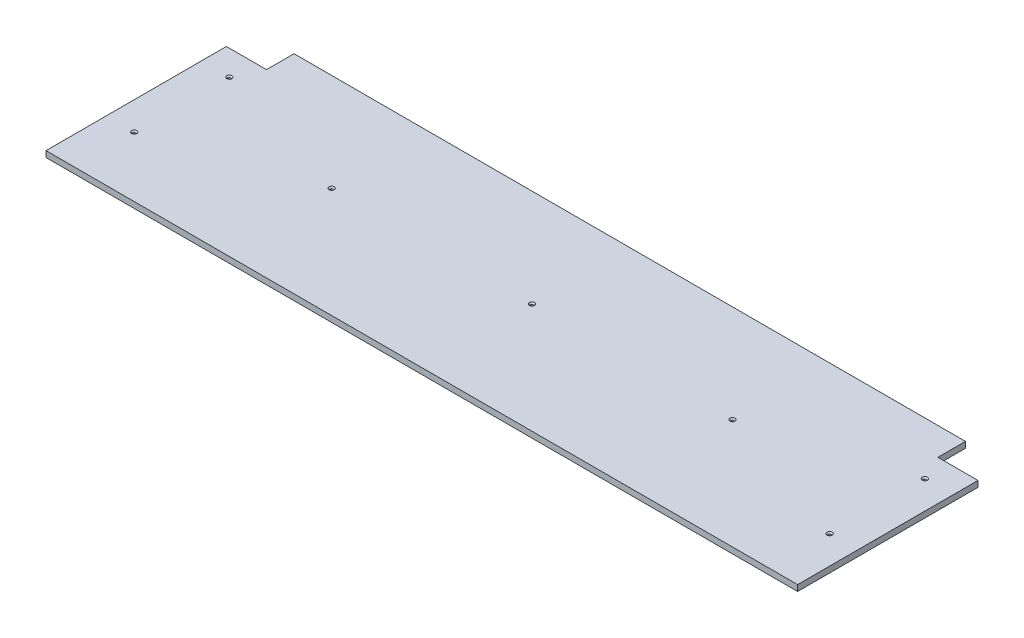
ISO-10303-21;
HEADER;
FILE_DESCRIPTION(('STEP AP214'),'2;1');
FILE_NAME('part.step','',(''),(''),'','','');
FILE_SCHEMA(('AUTOMOTIVE_DESIGN { 1 0 10303 214 1 1 1 1 }'));
ENDSEC;
DATA;
#1=APPLICATION_CONTEXT('core data for automotive mechanical design processes');
#2=APPLICATION_PROTOCOL_DEFINITION('international standard','automotive_design',2000,#1);
#3=PRODUCT_CONTEXT('',#1,'mechanical');
#4=PRODUCT('Part','Part','',(#3));
#5=PRODUCT_RELATED_PRODUCT_CATEGORY('part','',(#4));
#6=PRODUCT_DEFINITION_FORMATION('','',#4);
#7=PRODUCT_DEFINITION_CONTEXT('part definition',#1,'design');
#8=PRODUCT_DEFINITION('design','',#6,#7);
#9=PRODUCT_DEFINITION_SHAPE('','',#8);
#10=(LENGTH_UNIT() NAMED_UNIT(*) SI_UNIT(.MILLI.,.METRE.));
#11=(NAMED_UNIT(*) PLANE_ANGLE_UNIT() SI_UNIT($,.RADIAN.));
#12=(NAMED_UNIT(*) SI_UNIT($,.STERADIAN.) SOLID_ANGLE_UNIT());
#13=UNCERTAINTY_MEASURE_WITH_UNIT(LENGTH_MEASURE(1.E-05),#10,'distance_accuracy_value','');
#14=(GEOMETRIC_REPRESENTATION_CONTEXT(3) GLOBAL_UNCERTAINTY_ASSIGNED_CONTEXT((#13)) GLOBAL_UNIT_ASSIGNED_CONTEXT((#10,
#11,#12)) REPRESENTATION_CONTEXT('',''));
#15=CARTESIAN_POINT('',(0.,0.,0.));
#16=DIRECTION('',(0.,0.,1.));
#17=DIRECTION('',(1.,0.,0.));
#18=AXIS2_PLACEMENT_3D('',#15,#16,#17);
#19=CARTESIAN_POINT('',(-750.,12.,207.5));
#20=DIRECTION('',(1.,0.,0.));
#21=DIRECTION('',(0.,0.,-1.));
#22=AXIS2_PLACEMENT_3D('',#19,#20,#21);
#23=PLANE('',#22);
#24=DIRECTION('',(0.,-1.,0.));
#25=VECTOR('',#24,1.);
#26=CARTESIAN_POINT('',(-750.,12.,-152.5));
#27=LINE('',#26,#25);
#28=CARTESIAN_POINT('',(-750.,12.,-152.5));
#29=VERTEX_POINT('',#28);
#30=CARTESIAN_POINT('',(-750.,0.,-152.5));
#31=VERTEX_POINT('',#30);
#32=EDGE_CURVE('E104',#29,#31,#27,.T.);
#33=ORIENTED_EDGE('',*,*,#32,.T.);
#34=DIRECTION('',(0.,0.,1.));
#35=VECTOR('',#34,1.);
#36=CARTESIAN_POINT('',(-750.,0.,207.5));
#37=LINE('',#36,#35);
#38=CARTESIAN_POINT('',(-750.,0.,207.5));
#39=VERTEX_POINT('',#38);
#40=EDGE_CURVE('E204',#31,#39,#37,.T.);
#41=ORIENTED_EDGE('',*,*,#40,.T.);
#42=DIRECTION('',(0.,-1.,0.));
#43=VECTOR('',#42,1.);
#44=CARTESIAN_POINT('',(-750.,12.,207.5));
#45=LINE('',#44,#43);
#46=CARTESIAN_POINT('',(-750.,12.,207.5));
#47=VERTEX_POINT('',#46);
#48=EDGE_CURVE('E11',#47,#39,#45,.T.);
#49=ORIENTED_EDGE('',*,*,#48,.F.);
#50=DIRECTION('',(0.,0.,1.));
#51=VECTOR('',#50,1.);
#52=CARTESIAN_POINT('',(-750.,12.,207.5));
#53=LINE('',#52,#51);
#54=EDGE_CURVE('E205',#29,#47,#53,.T.);
#55=ORIENTED_EDGE('',*,*,#54,.F.);
#56=EDGE_LOOP('',(#33,#41,#49,#55));
#57=FACE_BOUND('',#56,.T.);
#58=ADVANCED_FACE('F34',(#57),#23,.F.);
#59=CARTESIAN_POINT('',(750.,12.,-207.5));
#60=DIRECTION('',(0.,0.,1.));
#61=DIRECTION('',(1.,0.,0.));
#62=AXIS2_PLACEMENT_3D('',#59,#60,#61);
#63=PLANE('',#62);
#64=DIRECTION('',(0.,-1.,0.));
#65=VECTOR('',#64,1.);
#66=CARTESIAN_POINT('',(-670.,12.,-207.5));
#67=LINE('',#66,#65);
#68=CARTESIAN_POINT('',(-670.,12.,-207.5));
#69=VERTEX_POINT('',#68);
#70=CARTESIAN_POINT('',(-670.,0.,-207.5));
#71=VERTEX_POINT('',#70);
#72=EDGE_CURVE('E124',#69,#71,#67,.T.);
#73=ORIENTED_EDGE('',*,*,#72,.F.);
#74=DIRECTION('',(-1.,0.,0.));
#75=VECTOR('',#74,1.);
#76=CARTESIAN_POINT('',(750.,12.,-207.5));
#77=LINE('',#76,#75);
#78=CARTESIAN_POINT('',(670.,12.,-207.5));
#79=VERTEX_POINT('',#78);
#80=EDGE_CURVE('E117',#79,#69,#77,.T.);
#81=ORIENTED_EDGE('',*,*,#80,.F.);
#82=DIRECTION('',(0.,-1.,0.));
#83=VECTOR('',#82,1.);
#84=CARTESIAN_POINT('',(670.,12.,-207.5));
#85=LINE('',#84,#83);
#86=CARTESIAN_POINT('',(670.,0.,-207.5));
#87=VERTEX_POINT('',#86);
#88=EDGE_CURVE('E122',#79,#87,#85,.T.);
#89=ORIENTED_EDGE('',*,*,#88,.T.);
#90=DIRECTION('',(-1.,0.,0.));
#91=VECTOR('',#90,1.);
#92=CARTESIAN_POINT('',(750.,0.,-207.5));
#93=LINE('',#92,#91);
#94=EDGE_CURVE('E208',#87,#71,#93,.T.);
#95=ORIENTED_EDGE('',*,*,#94,.T.);
#96=EDGE_LOOP('',(#73,#81,#89,#95));
#97=FACE_BOUND('',#96,.T.);
#98=ADVANCED_FACE('F243',(#97),#63,.F.);
#99=CARTESIAN_POINT('',(0.,12.,0.));
#100=DIRECTION('',(0.,1.,0.));
#101=DIRECTION('',(0.,0.,1.));
#102=AXIS2_PLACEMENT_3D('',#99,#100,#101);
#103=PLANE('',#102);
#104=CARTESIAN_POINT('',(694.,12.,-102.5));
#105=DIRECTION('',(0.,1.,0.));
#106=DIRECTION('',(0.,0.,1.));
#107=AXIS2_PLACEMENT_3D('',#104,#105,#106);
#108=CIRCLE('',#107,5.19999999999998);
#109=CARTESIAN_POINT('',(694.,12.,-97.3000000000002));
#110=VERTEX_POINT('',#109);
#111=EDGE_CURVE('E126',#110,#110,#108,.T.);
#112=ORIENTED_EDGE('',*,*,#111,.F.);
#113=EDGE_LOOP('',(#112));
#114=FACE_BOUND('',#113,.T.);
#115=CARTESIAN_POINT('',(694.,12.,87.4999999999999));
#116=DIRECTION('',(0.,1.,0.));
#117=DIRECTION('',(0.,0.,1.));
#118=AXIS2_PLACEMENT_3D('',#115,#116,#117);
#119=CIRCLE('',#118,5.19999999999998);
#120=CARTESIAN_POINT('',(694.,12.,92.6999999999998));
#121=VERTEX_POINT('',#120);
#122=EDGE_CURVE('E150',#121,#121,#119,.T.);
#123=ORIENTED_EDGE('',*,*,#122,.F.);
#124=EDGE_LOOP('',(#123));
#125=FACE_BOUND('',#124,.T.);
#126=CARTESIAN_POINT('',(400.,12.,-12.5000000000001));
#127=DIRECTION('',(0.,1.,0.));
#128=DIRECTION('',(0.,0.,1.));
#129=AXIS2_PLACEMENT_3D('',#126,#127,#128);
#130=CIRCLE('',#129,5.19999999999998);
#131=CARTESIAN_POINT('',(400.,12.,-7.30000000000014));
#132=VERTEX_POINT('',#131);
#133=EDGE_CURVE('E159',#132,#132,#130,.T.);
#134=ORIENTED_EDGE('',*,*,#133,.F.);
#135=EDGE_LOOP('',(#134));
#136=FACE_BOUND('',#135,.T.);
#137=CARTESIAN_POINT('',(-400.,12.,-12.5000000000001));
#138=DIRECTION('',(0.,1.,0.));
#139=DIRECTION('',(0.,0.,1.));
#140=AXIS2_PLACEMENT_3D('',#137,#138,#139);
#141=CIRCLE('',#140,5.19999999999998);
#142=CARTESIAN_POINT('',(-400.,12.,-7.30000000000014));
#143=VERTEX_POINT('',#142);
#144=EDGE_CURVE('E168',#143,#143,#141,.T.);
#145=ORIENTED_EDGE('',*,*,#144,.F.);
#146=EDGE_LOOP('',(#145));
#147=FACE_BOUND('',#146,.T.);
#148=CARTESIAN_POINT('',(-694.,12.,87.4999999999999));
#149=DIRECTION('',(0.,1.,0.));
#150=DIRECTION('',(0.,0.,1.));
#151=AXIS2_PLACEMENT_3D('',#148,#149,#150);
#152=CIRCLE('',#151,5.19999999999998);
#153=CARTESIAN_POINT('',(-694.,12.,92.6999999999998));
#154=VERTEX_POINT('',#153);
#155=EDGE_CURVE('E177',#154,#154,#152,.T.);
#156=ORIENTED_EDGE('',*,*,#155,.F.);
#157=EDGE_LOOP('',(#156));
#158=FACE_BOUND('',#157,.T.);
#159=CARTESIAN_POINT('',(-694.,12.,-102.5));
#160=DIRECTION('',(0.,1.,0.));
#161=DIRECTION('',(0.,0.,1.));
#162=AXIS2_PLACEMENT_3D('',#159,#160,#161);
#163=CIRCLE('',#162,5.19999999999998);
#164=CARTESIAN_POINT('',(-694.,12.,-97.3000000000002));
#165=VERTEX_POINT('',#164);
#166=EDGE_CURVE('E186',#165,#165,#163,.T.);
#167=ORIENTED_EDGE('',*,*,#166,.F.);
#168=EDGE_LOOP('',(#167));
#169=FACE_BOUND('',#168,.T.);
#170=CARTESIAN_POINT('',(0.,12.,-12.5000000000001));
#171=DIRECTION('',(0.,1.,0.));
#172=DIRECTION('',(0.,0.,1.));
#173=AXIS2_PLACEMENT_3D('',#170,#171,#172);
#174=CIRCLE('',#173,5.2);
#175=CARTESIAN_POINT('',(0.,12.,-7.30000000000012));
#176=VERTEX_POINT('',#175);
#177=EDGE_CURVE('E195',#176,#176,#174,.T.);
#178=ORIENTED_EDGE('',*,*,#177,.F.);
#179=EDGE_LOOP('',(#178));
#180=FACE_BOUND('',#179,.T.);
#181=ORIENTED_EDGE('',*,*,#80,.T.);
#182=DIRECTION('',(0.,0.,-1.));
#183=VECTOR('',#182,1.);
#184=CARTESIAN_POINT('',(-670.,12.,1.35245350272519E-12));
#185=LINE('',#184,#183);
#186=CARTESIAN_POINT('',(-670.,12.,-152.5));
#187=VERTEX_POINT('',#186);
#188=EDGE_CURVE('E108',#187,#69,#185,.T.);
#189=ORIENTED_EDGE('',*,*,#188,.F.);
#190=DIRECTION('',(1.,0.,0.));
#191=VECTOR('',#190,1.);
#192=CARTESIAN_POINT('',(-3.17454396103759E-13,12.,-152.500000000002));
#193=LINE('',#192,#191);
#194=EDGE_CURVE('E99',#29,#187,#193,.T.);
#195=ORIENTED_EDGE('',*,*,#194,.F.);
#196=ORIENTED_EDGE('',*,*,#54,.T.);
#197=DIRECTION('',(1.,0.,0.));
#198=VECTOR('',#197,1.);
#199=CARTESIAN_POINT('',(750.,12.,207.5));
#200=LINE('',#199,#198);
#201=CARTESIAN_POINT('',(750.,12.,207.5));
#202=VERTEX_POINT('',#201);
#203=EDGE_CURVE('E207',#47,#202,#200,.T.);
#204=ORIENTED_EDGE('',*,*,#203,.T.);
#205=DIRECTION('',(0.,0.,-1.));
#206=VECTOR('',#205,1.);
#207=CARTESIAN_POINT('',(750.,12.,207.5));
#208=LINE('',#207,#206);
#209=CARTESIAN_POINT('',(750.,12.,-152.5));
#210=VERTEX_POINT('',#209);
#211=EDGE_CURVE('E210',#202,#210,#208,.T.);
#212=ORIENTED_EDGE('',*,*,#211,.T.);
#213=DIRECTION('',(-1.,0.,0.));
#214=VECTOR('',#213,1.);
#215=CARTESIAN_POINT('',(0.,12.,-152.5));
#216=LINE('',#215,#214);
#217=CARTESIAN_POINT('',(670.,12.,-152.5));
#218=VERTEX_POINT('',#217);
#219=EDGE_CURVE('E128',#210,#218,#216,.T.);
#220=ORIENTED_EDGE('',*,*,#219,.T.);
#221=DIRECTION('',(0.,0.,-1.));
#222=VECTOR('',#221,1.);
#223=CARTESIAN_POINT('',(670.,12.,0.));
#224=LINE('',#223,#222);
#225=EDGE_CURVE('E131',#218,#79,#224,.T.);
#226=ORIENTED_EDGE('',*,*,#225,.T.);
#227=EDGE_LOOP('',(#181,#189,#195,#196,#204,#212,#220,#226));
#228=FACE_BOUND('',#227,.T.);
#229=ADVANCED_FACE('F114',(#114,#125,#136,#147,#158,#169,#180,#228),#103,.T.);
#230=CARTESIAN_POINT('',(0.,0.,0.));
#231=DIRECTION('',(0.,1.,0.));
#232=DIRECTION('',(0.,0.,1.));
#233=AXIS2_PLACEMENT_3D('',#230,#231,#232);
#234=PLANE('',#233);
#235=CARTESIAN_POINT('',(0.,0.,-12.5000000000001));
#236=DIRECTION('',(0.,1.,0.));
#237=DIRECTION('',(0.,0.,1.));
#238=AXIS2_PLACEMENT_3D('',#235,#236,#237);
#239=CIRCLE('',#238,2.6);
#240=CARTESIAN_POINT('',(0.,0.,-9.90000000000012));
#241=VERTEX_POINT('',#240);
#242=EDGE_CURVE('E201',#241,#241,#239,.T.);
#243=ORIENTED_EDGE('',*,*,#242,.T.);
#244=EDGE_LOOP('',(#243));
#245=FACE_BOUND('',#244,.T.);
#246=CARTESIAN_POINT('',(-694.,0.,-102.5));
#247=DIRECTION('',(0.,1.,0.));
#248=DIRECTION('',(0.,0.,1.));
#249=AXIS2_PLACEMENT_3D('',#246,#247,#248);
#250=CIRCLE('',#249,2.60000000000005);
#251=CARTESIAN_POINT('',(-694.,0.,-99.9000000000001));
#252=VERTEX_POINT('',#251);
#253=EDGE_CURVE('E192',#252,#252,#250,.T.);
#254=ORIENTED_EDGE('',*,*,#253,.T.);
#255=EDGE_LOOP('',(#254));
#256=FACE_BOUND('',#255,.T.);
#257=CARTESIAN_POINT('',(-694.,0.,87.4999999999999));
#258=DIRECTION('',(0.,1.,0.));
#259=DIRECTION('',(0.,0.,1.));
#260=AXIS2_PLACEMENT_3D('',#257,#258,#259);
#261=CIRCLE('',#260,2.60000000000005);
#262=CARTESIAN_POINT('',(-694.,0.,90.0999999999999));
#263=VERTEX_POINT('',#262);
#264=EDGE_CURVE('E183',#263,#263,#261,.T.);
#265=ORIENTED_EDGE('',*,*,#264,.T.);
#266=EDGE_LOOP('',(#265));
#267=FACE_BOUND('',#266,.T.);
#268=CARTESIAN_POINT('',(-400.,0.,-12.5000000000001));
#269=DIRECTION('',(0.,1.,0.));
#270=DIRECTION('',(0.,0.,1.));
#271=AXIS2_PLACEMENT_3D('',#268,#269,#270);
#272=CIRCLE('',#271,2.59999999999999);
#273=CARTESIAN_POINT('',(-400.,0.,-9.90000000000013));
#274=VERTEX_POINT('',#273);
#275=EDGE_CURVE('E174',#274,#274,#272,.T.);
#276=ORIENTED_EDGE('',*,*,#275,.T.);
#277=EDGE_LOOP('',(#276));
#278=FACE_BOUND('',#277,.T.);
#279=CARTESIAN_POINT('',(400.,0.,-12.5000000000001));
#280=DIRECTION('',(0.,1.,0.));
#281=DIRECTION('',(0.,0.,1.));
#282=AXIS2_PLACEMENT_3D('',#279,#280,#281);
#283=CIRCLE('',#282,2.59999999999999);
#284=CARTESIAN_POINT('',(400.,0.,-9.90000000000013));
#285=VERTEX_POINT('',#284);
#286=EDGE_CURVE('E165',#285,#285,#283,.T.);
#287=ORIENTED_EDGE('',*,*,#286,.T.);
#288=EDGE_LOOP('',(#287));
#289=FACE_BOUND('',#288,.T.);
#290=CARTESIAN_POINT('',(694.,0.,87.4999999999999));
#291=DIRECTION('',(0.,1.,0.));
#292=DIRECTION('',(0.,0.,1.));
#293=AXIS2_PLACEMENT_3D('',#290,#291,#292);
#294=CIRCLE('',#293,2.60000000000005);
#295=CARTESIAN_POINT('',(694.,0.,90.0999999999999));
#296=VERTEX_POINT('',#295);
#297=EDGE_CURVE('E156',#296,#296,#294,.T.);
#298=ORIENTED_EDGE('',*,*,#297,.T.);
#299=EDGE_LOOP('',(#298));
#300=FACE_BOUND('',#299,.T.);
#301=CARTESIAN_POINT('',(694.,0.,-102.5));
#302=DIRECTION('',(0.,1.,0.));
#303=DIRECTION('',(0.,0.,1.));
#304=AXIS2_PLACEMENT_3D('',#301,#302,#303);
#305=CIRCLE('',#304,2.60000000000005);
#306=CARTESIAN_POINT('',(694.,0.,-99.9000000000001));
#307=VERTEX_POINT('',#306);
#308=EDGE_CURVE('E147',#307,#307,#305,.T.);
#309=ORIENTED_EDGE('',*,*,#308,.T.);
#310=EDGE_LOOP('',(#309));
#311=FACE_BOUND('',#310,.T.);
#312=DIRECTION('',(0.,0.,-1.));
#313=VECTOR('',#312,1.);
#314=CARTESIAN_POINT('',(-670.,0.,1.35245350272519E-12));
#315=LINE('',#314,#313);
#316=CARTESIAN_POINT('',(-670.,0.,-152.5));
#317=VERTEX_POINT('',#316);
#318=EDGE_CURVE('E48',#317,#71,#315,.T.);
#319=ORIENTED_EDGE('',*,*,#318,.T.);
#320=ORIENTED_EDGE('',*,*,#94,.F.);
#321=DIRECTION('',(0.,0.,-1.));
#322=VECTOR('',#321,1.);
#323=CARTESIAN_POINT('',(670.,0.,0.));
#324=LINE('',#323,#322);
#325=CARTESIAN_POINT('',(670.,0.,-152.5));
#326=VERTEX_POINT('',#325);
#327=EDGE_CURVE('E132',#326,#87,#324,.T.);
#328=ORIENTED_EDGE('',*,*,#327,.F.);
#329=DIRECTION('',(-1.,0.,0.));
#330=VECTOR('',#329,1.);
#331=CARTESIAN_POINT('',(0.,0.,-152.5));
#332=LINE('',#331,#330);
#333=CARTESIAN_POINT('',(750.,0.,-152.5));
#334=VERTEX_POINT('',#333);
#335=EDGE_CURVE('E134',#334,#326,#332,.T.);
#336=ORIENTED_EDGE('',*,*,#335,.F.);
#337=DIRECTION('',(0.,0.,-1.));
#338=VECTOR('',#337,1.);
#339=CARTESIAN_POINT('',(750.,0.,207.5));
#340=LINE('',#339,#338);
#341=CARTESIAN_POINT('',(750.,0.,207.5));
#342=VERTEX_POINT('',#341);
#343=EDGE_CURVE('E217',#342,#334,#340,.T.);
#344=ORIENTED_EDGE('',*,*,#343,.F.);
#345=DIRECTION('',(1.,0.,0.));
#346=VECTOR('',#345,1.);
#347=CARTESIAN_POINT('',(750.,0.,207.5));
#348=LINE('',#347,#346);
#349=EDGE_CURVE('E215',#39,#342,#348,.T.);
#350=ORIENTED_EDGE('',*,*,#349,.F.);
#351=ORIENTED_EDGE('',*,*,#40,.F.);
#352=DIRECTION('',(1.,0.,0.));
#353=VECTOR('',#352,1.);
#354=CARTESIAN_POINT('',(-3.17454396103759E-13,0.,-152.500000000002));
#355=LINE('',#354,#353);
#356=EDGE_CURVE('E118',#31,#317,#355,.T.);
#357=ORIENTED_EDGE('',*,*,#356,.T.);
#358=EDGE_LOOP('',(#319,#320,#328,#336,#344,#350,#351,#357));
#359=FACE_BOUND('',#358,.T.);
#360=ADVANCED_FACE('F231',(#245,#256,#267,#278,#289,#300,#311,#359),#234,.F.);
#361=CARTESIAN_POINT('',(750.,12.,207.5));
#362=DIRECTION('',(0.,0.,-1.));
#363=DIRECTION('',(-1.,0.,0.));
#364=AXIS2_PLACEMENT_3D('',#361,#362,#363);
#365=PLANE('',#364);
#366=ORIENTED_EDGE('',*,*,#349,.T.);
#367=DIRECTION('',(0.,-1.,0.));
#368=VECTOR('',#367,1.);
#369=CARTESIAN_POINT('',(750.,12.,207.5));
#370=LINE('',#369,#368);
#371=EDGE_CURVE('E41',#202,#342,#370,.T.);
#372=ORIENTED_EDGE('',*,*,#371,.F.);
#373=ORIENTED_EDGE('',*,*,#203,.F.);
#374=ORIENTED_EDGE('',*,*,#48,.T.);
#375=EDGE_LOOP('',(#366,#372,#373,#374));
#376=FACE_BOUND('',#375,.T.);
#377=ADVANCED_FACE('F240',(#376),#365,.F.);
#378=CARTESIAN_POINT('',(750.,12.,207.5));
#379=DIRECTION('',(-1.,0.,0.));
#380=DIRECTION('',(0.,0.,1.));
#381=AXIS2_PLACEMENT_3D('',#378,#379,#380);
#382=PLANE('',#381);
#383=ORIENTED_EDGE('',*,*,#343,.T.);
#384=DIRECTION('',(0.,-1.,0.));
#385=VECTOR('',#384,1.);
#386=CARTESIAN_POINT('',(750.,12.,-152.5));
#387=LINE('',#386,#385);
#388=EDGE_CURVE('E56',#210,#334,#387,.T.);
#389=ORIENTED_EDGE('',*,*,#388,.F.);
#390=ORIENTED_EDGE('',*,*,#211,.F.);
#391=ORIENTED_EDGE('',*,*,#371,.T.);
#392=EDGE_LOOP('',(#383,#389,#390,#391));
#393=FACE_BOUND('',#392,.T.);
#394=ADVANCED_FACE('F226',(#393),#382,.F.);
#395=CARTESIAN_POINT('',(0.,12.,-12.5000000000001));
#396=DIRECTION('',(0.,1.,0.));
#397=DIRECTION('',(0.,0.,1.));
#398=AXIS2_PLACEMENT_3D('',#395,#396,#397);
#399=CYLINDRICAL_SURFACE('',#398,2.6);
#400=ORIENTED_EDGE('',*,*,#242,.F.);
#401=EDGE_LOOP('',(#400));
#402=FACE_BOUND('',#401,.T.);
#403=CARTESIAN_POINT('',(0.,9.4,-12.5000000000001));
#404=DIRECTION('',(0.,1.,0.));
#405=DIRECTION('',(0.,0.,1.));
#406=AXIS2_PLACEMENT_3D('',#403,#404,#405);
#407=CIRCLE('',#406,2.6);
#408=CARTESIAN_POINT('',(0.,9.4,-9.90000000000012));
#409=VERTEX_POINT('',#408);
#410=EDGE_CURVE('E198',#409,#409,#407,.T.);
#411=ORIENTED_EDGE('',*,*,#410,.T.);
#412=EDGE_LOOP('',(#411));
#413=FACE_BOUND('',#412,.T.);
#414=ADVANCED_FACE('F255',(#402,#413),#399,.F.);
#415=CARTESIAN_POINT('',(0.,12.,-12.5000000000001));
#416=DIRECTION('',(0.,1.,0.));
#417=DIRECTION('',(0.,0.,1.));
#418=AXIS2_PLACEMENT_3D('',#415,#416,#417);
#419=CONICAL_SURFACE('',#418,5.2,0.785398163397449);
#420=ORIENTED_EDGE('',*,*,#410,.F.);
#421=EDGE_LOOP('',(#420));
#422=FACE_BOUND('',#421,.T.);
#423=ORIENTED_EDGE('',*,*,#177,.T.);
#424=EDGE_LOOP('',(#423));
#425=FACE_BOUND('',#424,.T.);
#426=ADVANCED_FACE('F302',(#422,#425),#419,.F.);
#427=CARTESIAN_POINT('',(-694.,12.,-102.5));
#428=DIRECTION('',(0.,1.,0.));
#429=DIRECTION('',(0.,0.,1.));
#430=AXIS2_PLACEMENT_3D('',#427,#428,#429);
#431=CYLINDRICAL_SURFACE('',#430,2.60000000000005);
#432=ORIENTED_EDGE('',*,*,#253,.F.);
#433=EDGE_LOOP('',(#432));
#434=FACE_BOUND('',#433,.T.);
#435=CARTESIAN_POINT('',(-694.,9.4,-102.5));
#436=DIRECTION('',(0.,1.,0.));
#437=DIRECTION('',(0.,0.,1.));
#438=AXIS2_PLACEMENT_3D('',#435,#436,#437);
#439=CIRCLE('',#438,2.60000000000005);
#440=CARTESIAN_POINT('',(-694.,9.4,-99.9000000000001));
#441=VERTEX_POINT('',#440);
#442=EDGE_CURVE('E189',#441,#441,#439,.T.);
#443=ORIENTED_EDGE('',*,*,#442,.T.);
#444=EDGE_LOOP('',(#443));
#445=FACE_BOUND('',#444,.T.);
#446=ADVANCED_FACE('F304',(#434,#445),#431,.F.);
#447=CARTESIAN_POINT('',(-694.,12.,-102.5));
#448=DIRECTION('',(0.,1.,0.));
#449=DIRECTION('',(0.,0.,1.));
#450=AXIS2_PLACEMENT_3D('',#447,#448,#449);
#451=CONICAL_SURFACE('',#450,5.19999999999998,0.785398163397436);
#452=ORIENTED_EDGE('',*,*,#442,.F.);
#453=EDGE_LOOP('',(#452));
#454=FACE_BOUND('',#453,.T.);
#455=ORIENTED_EDGE('',*,*,#166,.T.);
#456=EDGE_LOOP('',(#455));
#457=FACE_BOUND('',#456,.T.);
#458=ADVANCED_FACE('F311',(#454,#457),#451,.F.);
#459=CARTESIAN_POINT('',(-694.,12.,87.4999999999999));
#460=DIRECTION('',(0.,1.,0.));
#461=DIRECTION('',(0.,0.,1.));
#462=AXIS2_PLACEMENT_3D('',#459,#460,#461);
#463=CYLINDRICAL_SURFACE('',#462,2.60000000000005);
#464=ORIENTED_EDGE('',*,*,#264,.F.);
#465=EDGE_LOOP('',(#464));
#466=FACE_BOUND('',#465,.T.);
#467=CARTESIAN_POINT('',(-694.,9.4,87.4999999999999));
#468=DIRECTION('',(0.,1.,0.));
#469=DIRECTION('',(0.,0.,1.));
#470=AXIS2_PLACEMENT_3D('',#467,#468,#469);
#471=CIRCLE('',#470,2.60000000000005);
#472=CARTESIAN_POINT('',(-694.,9.4,90.0999999999999));
#473=VERTEX_POINT('',#472);
#474=EDGE_CURVE('E180',#473,#473,#471,.T.);
#475=ORIENTED_EDGE('',*,*,#474,.T.);
#476=EDGE_LOOP('',(#475));
#477=FACE_BOUND('',#476,.T.);
#478=ADVANCED_FACE('F320',(#466,#477),#463,.F.);
#479=CARTESIAN_POINT('',(-694.,12.,87.4999999999999));
#480=DIRECTION('',(0.,1.,0.));
#481=DIRECTION('',(0.,0.,1.));
#482=AXIS2_PLACEMENT_3D('',#479,#480,#481);
#483=CONICAL_SURFACE('',#482,5.19999999999998,0.785398163397436);
#484=ORIENTED_EDGE('',*,*,#474,.F.);
#485=EDGE_LOOP('',(#484));
#486=FACE_BOUND('',#485,.T.);
#487=ORIENTED_EDGE('',*,*,#155,.T.);
#488=EDGE_LOOP('',(#487));
#489=FACE_BOUND('',#488,.T.);
#490=ADVANCED_FACE('F324',(#486,#489),#483,.F.);
#491=CARTESIAN_POINT('',(-400.,12.,-12.5000000000001));
#492=DIRECTION('',(0.,1.,0.));
#493=DIRECTION('',(0.,0.,1.));
#494=AXIS2_PLACEMENT_3D('',#491,#492,#493);
#495=CYLINDRICAL_SURFACE('',#494,2.59999999999999);
#496=ORIENTED_EDGE('',*,*,#275,.F.);
#497=EDGE_LOOP('',(#496));
#498=FACE_BOUND('',#497,.T.);
#499=CARTESIAN_POINT('',(-400.,9.4,-12.5000000000001));
#500=DIRECTION('',(0.,1.,0.));
#501=DIRECTION('',(0.,0.,1.));
#502=AXIS2_PLACEMENT_3D('',#499,#500,#501);
#503=CIRCLE('',#502,2.59999999999999);
#504=CARTESIAN_POINT('',(-400.,9.4,-9.90000000000013));
#505=VERTEX_POINT('',#504);
#506=EDGE_CURVE('E171',#505,#505,#503,.T.);
#507=ORIENTED_EDGE('',*,*,#506,.T.);
#508=EDGE_LOOP('',(#507));
#509=FACE_BOUND('',#508,.T.);
#510=ADVANCED_FACE('F328',(#498,#509),#495,.F.);
#511=CARTESIAN_POINT('',(-400.,12.,-12.5000000000001));
#512=DIRECTION('',(0.,1.,0.));
#513=DIRECTION('',(0.,0.,1.));
#514=AXIS2_PLACEMENT_3D('',#511,#512,#513);
#515=CONICAL_SURFACE('',#514,5.19999999999998,0.785398163397447);
#516=ORIENTED_EDGE('',*,*,#506,.F.);
#517=EDGE_LOOP('',(#516));
#518=FACE_BOUND('',#517,.T.);
#519=ORIENTED_EDGE('',*,*,#144,.T.);
#520=EDGE_LOOP('',(#519));
#521=FACE_BOUND('',#520,.T.);
#522=ADVANCED_FACE('F332',(#518,#521),#515,.F.);
#523=CARTESIAN_POINT('',(400.,12.,-12.5000000000001));
#524=DIRECTION('',(0.,1.,0.));
#525=DIRECTION('',(0.,0.,1.));
#526=AXIS2_PLACEMENT_3D('',#523,#524,#525);
#527=CYLINDRICAL_SURFACE('',#526,2.59999999999999);
#528=ORIENTED_EDGE('',*,*,#286,.F.);
#529=EDGE_LOOP('',(#528));
#530=FACE_BOUND('',#529,.T.);
#531=CARTESIAN_POINT('',(400.,9.4,-12.5000000000001));
#532=DIRECTION('',(0.,1.,0.));
#533=DIRECTION('',(0.,0.,1.));
#534=AXIS2_PLACEMENT_3D('',#531,#532,#533);
#535=CIRCLE('',#534,2.59999999999999);
#536=CARTESIAN_POINT('',(400.,9.4,-9.90000000000013));
#537=VERTEX_POINT('',#536);
#538=EDGE_CURVE('E162',#537,#537,#535,.T.);
#539=ORIENTED_EDGE('',*,*,#538,.T.);
#540=EDGE_LOOP('',(#539));
#541=FACE_BOUND('',#540,.T.);
#542=ADVANCED_FACE('F336',(#530,#541),#527,.F.);
#543=CARTESIAN_POINT('',(400.,12.,-12.5000000000001));
#544=DIRECTION('',(0.,1.,0.));
#545=DIRECTION('',(0.,0.,1.));
#546=AXIS2_PLACEMENT_3D('',#543,#544,#545);
#547=CONICAL_SURFACE('',#546,5.19999999999998,0.785398163397447);
#548=ORIENTED_EDGE('',*,*,#538,.F.);
#549=EDGE_LOOP('',(#548));
#550=FACE_BOUND('',#549,.T.);
#551=ORIENTED_EDGE('',*,*,#133,.T.);
#552=EDGE_LOOP('',(#551));
#553=FACE_BOUND('',#552,.T.);
#554=ADVANCED_FACE('F340',(#550,#553),#547,.F.);
#555=CARTESIAN_POINT('',(694.,12.,87.4999999999999));
#556=DIRECTION('',(0.,1.,0.));
#557=DIRECTION('',(0.,0.,1.));
#558=AXIS2_PLACEMENT_3D('',#555,#556,#557);
#559=CYLINDRICAL_SURFACE('',#558,2.60000000000005);
#560=ORIENTED_EDGE('',*,*,#297,.F.);
#561=EDGE_LOOP('',(#560));
#562=FACE_BOUND('',#561,.T.);
#563=CARTESIAN_POINT('',(694.,9.4,87.4999999999999));
#564=DIRECTION('',(0.,1.,0.));
#565=DIRECTION('',(0.,0.,1.));
#566=AXIS2_PLACEMENT_3D('',#563,#564,#565);
#567=CIRCLE('',#566,2.60000000000005);
#568=CARTESIAN_POINT('',(694.,9.4,90.0999999999999));
#569=VERTEX_POINT('',#568);
#570=EDGE_CURVE('E153',#569,#569,#567,.T.);
#571=ORIENTED_EDGE('',*,*,#570,.T.);
#572=EDGE_LOOP('',(#571));
#573=FACE_BOUND('',#572,.T.);
#574=ADVANCED_FACE('F344',(#562,#573),#559,.F.);
#575=CARTESIAN_POINT('',(694.,12.,87.4999999999999));
#576=DIRECTION('',(0.,1.,0.));
#577=DIRECTION('',(0.,0.,1.));
#578=AXIS2_PLACEMENT_3D('',#575,#576,#577);
#579=CONICAL_SURFACE('',#578,5.19999999999998,0.785398163397436);
#580=ORIENTED_EDGE('',*,*,#570,.F.);
#581=EDGE_LOOP('',(#580));
#582=FACE_BOUND('',#581,.T.);
#583=ORIENTED_EDGE('',*,*,#122,.T.);
#584=EDGE_LOOP('',(#583));
#585=FACE_BOUND('',#584,.T.);
#586=ADVANCED_FACE('F281',(#582,#585),#579,.F.);
#587=CARTESIAN_POINT('',(694.,12.,-102.5));
#588=DIRECTION('',(0.,1.,0.));
#589=DIRECTION('',(0.,0.,1.));
#590=AXIS2_PLACEMENT_3D('',#587,#588,#589);
#591=CYLINDRICAL_SURFACE('',#590,2.60000000000005);
#592=ORIENTED_EDGE('',*,*,#308,.F.);
#593=EDGE_LOOP('',(#592));
#594=FACE_BOUND('',#593,.T.);
#595=CARTESIAN_POINT('',(694.,9.4,-102.5));
#596=DIRECTION('',(0.,1.,0.));
#597=DIRECTION('',(0.,0.,1.));
#598=AXIS2_PLACEMENT_3D('',#595,#596,#597);
#599=CIRCLE('',#598,2.60000000000005);
#600=CARTESIAN_POINT('',(694.,9.4,-99.9000000000001));
#601=VERTEX_POINT('',#600);
#602=EDGE_CURVE('E144',#601,#601,#599,.T.);
#603=ORIENTED_EDGE('',*,*,#602,.T.);
#604=EDGE_LOOP('',(#603));
#605=FACE_BOUND('',#604,.T.);
#606=ADVANCED_FACE('F277',(#594,#605),#591,.F.);
#607=CARTESIAN_POINT('',(694.,12.,-102.5));
#608=DIRECTION('',(0.,1.,0.));
#609=DIRECTION('',(0.,0.,1.));
#610=AXIS2_PLACEMENT_3D('',#607,#608,#609);
#611=CONICAL_SURFACE('',#610,5.19999999999998,0.785398163397436);
#612=ORIENTED_EDGE('',*,*,#602,.F.);
#613=EDGE_LOOP('',(#612));
#614=FACE_BOUND('',#613,.T.);
#615=ORIENTED_EDGE('',*,*,#111,.T.);
#616=EDGE_LOOP('',(#615));
#617=FACE_BOUND('',#616,.T.);
#618=ADVANCED_FACE('F280',(#614,#617),#611,.F.);
#619=CARTESIAN_POINT('',(670.,12.,0.));
#620=DIRECTION('',(-1.,0.,0.));
#621=DIRECTION('',(0.,0.,1.));
#622=AXIS2_PLACEMENT_3D('',#619,#620,#621);
#623=PLANE('',#622);
#624=ORIENTED_EDGE('',*,*,#327,.T.);
#625=ORIENTED_EDGE('',*,*,#88,.F.);
#626=ORIENTED_EDGE('',*,*,#225,.F.);
#627=DIRECTION('',(0.,-1.,0.));
#628=VECTOR('',#627,1.);
#629=CARTESIAN_POINT('',(670.,12.,-152.5));
#630=LINE('',#629,#628);
#631=EDGE_CURVE('E139',#218,#326,#630,.T.);
#632=ORIENTED_EDGE('',*,*,#631,.T.);
#633=EDGE_LOOP('',(#624,#625,#626,#632));
#634=FACE_BOUND('',#633,.T.);
#635=ADVANCED_FACE('F238',(#634),#623,.F.);
#636=CARTESIAN_POINT('',(0.,12.,-152.5));
#637=DIRECTION('',(0.,0.,1.));
#638=DIRECTION('',(1.,0.,0.));
#639=AXIS2_PLACEMENT_3D('',#636,#637,#638);
#640=PLANE('',#639);
#641=ORIENTED_EDGE('',*,*,#335,.T.);
#642=ORIENTED_EDGE('',*,*,#631,.F.);
#643=ORIENTED_EDGE('',*,*,#219,.F.);
#644=ORIENTED_EDGE('',*,*,#388,.T.);
#645=EDGE_LOOP('',(#641,#642,#643,#644));
#646=FACE_BOUND('',#645,.T.);
#647=ADVANCED_FACE('F235',(#646),#640,.F.);
#648=CARTESIAN_POINT('',(-670.,12.,1.35245350272519E-12));
#649=DIRECTION('',(-1.,0.,0.));
#650=DIRECTION('',(0.,0.,1.));
#651=AXIS2_PLACEMENT_3D('',#648,#649,#650);
#652=PLANE('',#651);
#653=ORIENTED_EDGE('',*,*,#318,.F.);
#654=DIRECTION('',(0.,-1.,0.));
#655=VECTOR('',#654,1.);
#656=CARTESIAN_POINT('',(-670.,12.,-152.5));
#657=LINE('',#656,#655);
#658=EDGE_CURVE('E101',#187,#317,#657,.T.);
#659=ORIENTED_EDGE('',*,*,#658,.F.);
#660=ORIENTED_EDGE('',*,*,#188,.T.);
#661=ORIENTED_EDGE('',*,*,#72,.T.);
#662=EDGE_LOOP('',(#653,#659,#660,#661));
#663=FACE_BOUND('',#662,.T.);
#664=ADVANCED_FACE('F110',(#663),#652,.T.);
#665=CARTESIAN_POINT('',(-3.17454396103759E-13,12.,-152.500000000002));
#666=DIRECTION('',(0.,0.,-1.));
#667=DIRECTION('',(-1.,0.,0.));
#668=AXIS2_PLACEMENT_3D('',#665,#666,#667);
#669=PLANE('',#668);
#670=ORIENTED_EDGE('',*,*,#356,.F.);
#671=ORIENTED_EDGE('',*,*,#32,.F.);
#672=ORIENTED_EDGE('',*,*,#194,.T.);
#673=ORIENTED_EDGE('',*,*,#658,.T.);
#674=EDGE_LOOP('',(#670,#671,#672,#673));
#675=FACE_BOUND('',#674,.T.);
#676=ADVANCED_FACE('F100',(#675),#669,.T.);
#677=CLOSED_SHELL('',(#58,#98,#229,#360,#377,#394,#414,#426,#446,#458,#478,#490,#510,#522,#542,
#554,#574,#586,#606,#618,#635,#647,#664,#676));
#678=MANIFOLD_SOLID_BREP('B2',#677);
#679=ADVANCED_BREP_SHAPE_REPRESENTATION('',(#18,#678),#14);
#680=SHAPE_DEFINITION_REPRESENTATION(#9,#679);
ENDSEC;
END-ISO-10303-21;
